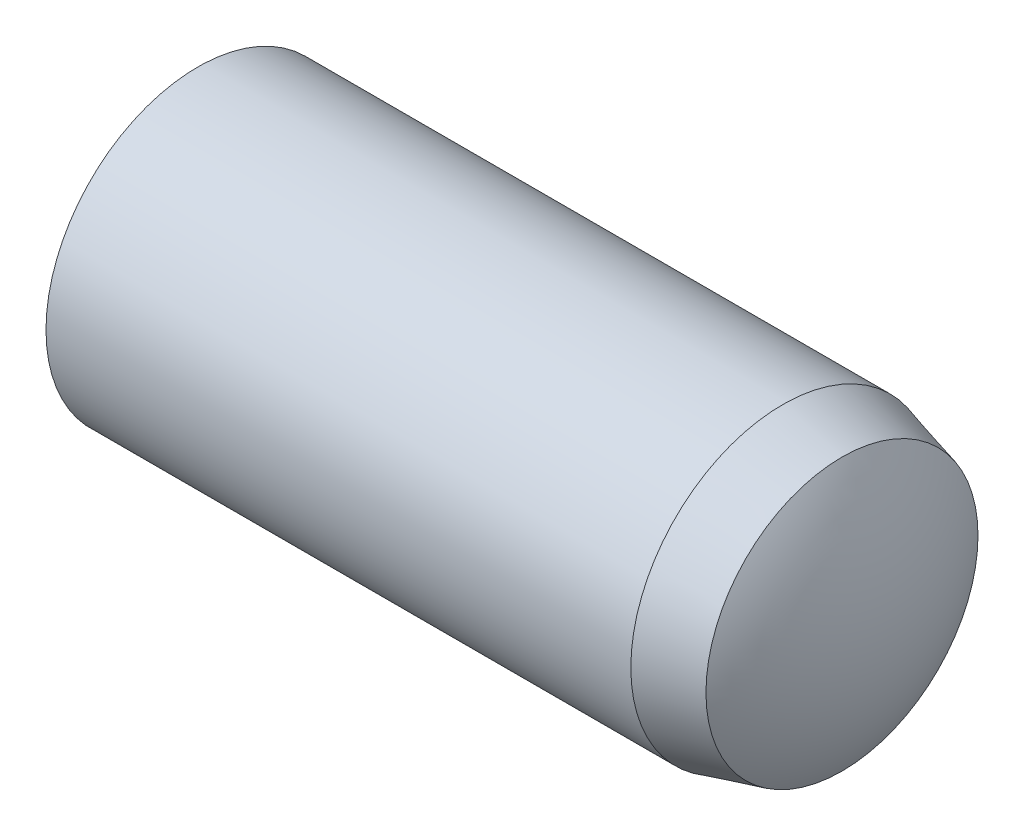
ISO-10303-21;
HEADER;
FILE_DESCRIPTION(('STEP AP214'),'2;1');
FILE_NAME('part.step','',(''),(''),'','','');
FILE_SCHEMA(('AUTOMOTIVE_DESIGN { 1 0 10303 214 1 1 1 1 }'));
ENDSEC;
DATA;
#1=APPLICATION_CONTEXT('core data for automotive mechanical design processes');
#2=APPLICATION_PROTOCOL_DEFINITION('international standard','automotive_design',2000,#1);
#3=PRODUCT_CONTEXT('',#1,'mechanical');
#4=PRODUCT('Part','Part','',(#3));
#5=PRODUCT_RELATED_PRODUCT_CATEGORY('part','',(#4));
#6=PRODUCT_DEFINITION_FORMATION('','',#4);
#7=PRODUCT_DEFINITION_CONTEXT('part definition',#1,'design');
#8=PRODUCT_DEFINITION('design','',#6,#7);
#9=PRODUCT_DEFINITION_SHAPE('','',#8);
#10=(LENGTH_UNIT() NAMED_UNIT(*) SI_UNIT(.MILLI.,.METRE.));
#11=(NAMED_UNIT(*) PLANE_ANGLE_UNIT() SI_UNIT($,.RADIAN.));
#12=(NAMED_UNIT(*) SI_UNIT($,.STERADIAN.) SOLID_ANGLE_UNIT());
#13=UNCERTAINTY_MEASURE_WITH_UNIT(LENGTH_MEASURE(1.E-05),#10,'distance_accuracy_value','');
#14=(GEOMETRIC_REPRESENTATION_CONTEXT(3) GLOBAL_UNCERTAINTY_ASSIGNED_CONTEXT((#13)) GLOBAL_UNIT_ASSIGNED_CONTEXT((#10,
#11,#12)) REPRESENTATION_CONTEXT('',''));
#15=CARTESIAN_POINT('',(0.,0.,0.));
#16=DIRECTION('',(0.,0.,1.));
#17=DIRECTION('',(1.,0.,0.));
#18=AXIS2_PLACEMENT_3D('',#15,#16,#17);
#19=CARTESIAN_POINT('',(-6.,0.,0.));
#20=DIRECTION('',(1.,0.,0.));
#21=DIRECTION('',(0.,0.,-1.));
#22=AXIS2_PLACEMENT_3D('',#19,#20,#21);
#23=CYLINDRICAL_SURFACE('',#22,2.5);
#24=CARTESIAN_POINT('',(4.375,0.,0.));
#25=DIRECTION('',(-1.,0.,0.));
#26=DIRECTION('',(0.,0.,1.));
#27=AXIS2_PLACEMENT_3D('',#24,#25,#26);
#28=CIRCLE('',#27,2.49999999999999);
#29=CARTESIAN_POINT('',(4.375,0.,2.49999999999999));
#30=VERTEX_POINT('',#29);
#31=EDGE_CURVE('E11',#30,#30,#28,.T.);
#32=ORIENTED_EDGE('',*,*,#31,.T.);
#33=EDGE_LOOP('',(#32));
#34=FACE_BOUND('',#33,.T.);
#35=CARTESIAN_POINT('',(-5.25,0.,0.));
#36=DIRECTION('',(-1.,0.,0.));
#37=DIRECTION('',(0.,0.,1.));
#38=AXIS2_PLACEMENT_3D('',#35,#36,#37);
#39=CIRCLE('',#38,2.5);
#40=CARTESIAN_POINT('',(-5.25,0.,2.5));
#41=VERTEX_POINT('',#40);
#42=EDGE_CURVE('E52',#41,#41,#39,.T.);
#43=ORIENTED_EDGE('',*,*,#42,.F.);
#44=EDGE_LOOP('',(#43));
#45=FACE_BOUND('',#44,.T.);
#46=ADVANCED_FACE('F32',(#34,#45),#23,.T.);
#47=CARTESIAN_POINT('',(4.375,0.,0.));
#48=DIRECTION('',(-1.,0.,0.));
#49=DIRECTION('',(0.,0.,1.));
#50=AXIS2_PLACEMENT_3D('',#47,#48,#49);
#51=CONICAL_SURFACE('',#50,2.49999999999999,0.261799387799151);
#52=CARTESIAN_POINT('',(5.35,0.,0.));
#53=DIRECTION('',(-1.,0.,0.));
#54=DIRECTION('',(0.,0.,1.));
#55=AXIS2_PLACEMENT_3D('',#52,#53,#54);
#56=CIRCLE('',#55,2.23874953737965);
#57=CARTESIAN_POINT('',(5.35,0.,2.23874953737965));
#58=VERTEX_POINT('',#57);
#59=EDGE_CURVE('E39',#58,#58,#56,.T.);
#60=ORIENTED_EDGE('',*,*,#59,.T.);
#61=EDGE_LOOP('',(#60));
#62=FACE_BOUND('',#61,.T.);
#63=ORIENTED_EDGE('',*,*,#31,.F.);
#64=EDGE_LOOP('',(#63));
#65=FACE_BOUND('',#64,.T.);
#66=ADVANCED_FACE('F58',(#62,#65),#51,.T.);
#67=CARTESIAN_POINT('',(1.81961577606338,0.,0.));
#68=DIRECTION('',(-1.,0.,0.));
#69=DIRECTION('',(0.,1.,0.));
#70=AXIS2_PLACEMENT_3D('',#67,#68,#69);
#71=SPHERICAL_SURFACE('',#70,4.18038422393662);
#72=CARTESIAN_POINT('',(6.,0.,0.));
#73=VERTEX_POINT('',#72);
#74=VERTEX_LOOP('',#73);
#75=FACE_BOUND('',#74,.T.);
#76=ORIENTED_EDGE('',*,*,#59,.F.);
#77=EDGE_LOOP('',(#76));
#78=FACE_BOUND('',#77,.T.);
#79=ADVANCED_FACE('F48',(#75,#78),#71,.T.);
#80=CARTESIAN_POINT('',(-1.45833333333333,0.,0.));
#81=DIRECTION('',(-1.,0.,0.));
#82=DIRECTION('',(0.,-1.,0.));
#83=AXIS2_PLACEMENT_3D('',#80,#81,#82);
#84=SPHERICAL_SURFACE('',#83,4.54166666666667);
#85=CARTESIAN_POINT('',(-6.,0.,0.));
#86=VERTEX_POINT('',#85);
#87=VERTEX_LOOP('',#86);
#88=FACE_BOUND('',#87,.T.);
#89=ORIENTED_EDGE('',*,*,#42,.T.);
#90=EDGE_LOOP('',(#89));
#91=FACE_BOUND('',#90,.T.);
#92=ADVANCED_FACE('F45',(#88,#91),#84,.T.);
#93=CLOSED_SHELL('',(#46,#66,#79,#92));
#94=MANIFOLD_SOLID_BREP('B2',#93);
#95=ADVANCED_BREP_SHAPE_REPRESENTATION('',(#18,#94),#14);
#96=SHAPE_DEFINITION_REPRESENTATION(#9,#95);
ENDSEC;
END-ISO-10303-21;
